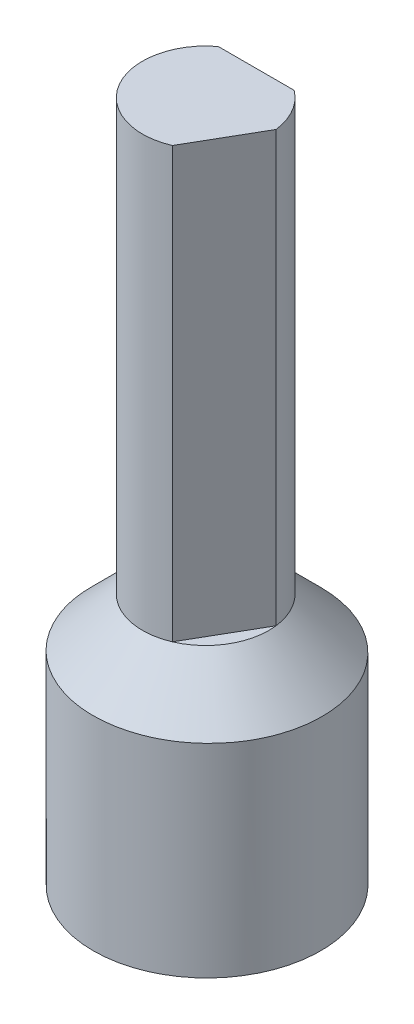
ISO-10303-21;
HEADER;
FILE_DESCRIPTION(('STEP AP214'),'2;1');
FILE_NAME('part.step','',(''),(''),'','','');
FILE_SCHEMA(('AUTOMOTIVE_DESIGN { 1 0 10303 214 1 1 1 1 }'));
ENDSEC;
DATA;
#1=APPLICATION_CONTEXT('core data for automotive mechanical design processes');
#2=APPLICATION_PROTOCOL_DEFINITION('international standard','automotive_design',2000,#1);
#3=PRODUCT_CONTEXT('',#1,'mechanical');
#4=PRODUCT('Part','Part','',(#3));
#5=PRODUCT_RELATED_PRODUCT_CATEGORY('part','',(#4));
#6=PRODUCT_DEFINITION_FORMATION('','',#4);
#7=PRODUCT_DEFINITION_CONTEXT('part definition',#1,'design');
#8=PRODUCT_DEFINITION('design','',#6,#7);
#9=PRODUCT_DEFINITION_SHAPE('','',#8);
#10=(LENGTH_UNIT() NAMED_UNIT(*) SI_UNIT(.MILLI.,.METRE.));
#11=(NAMED_UNIT(*) PLANE_ANGLE_UNIT() SI_UNIT($,.RADIAN.));
#12=(NAMED_UNIT(*) SI_UNIT($,.STERADIAN.) SOLID_ANGLE_UNIT());
#13=UNCERTAINTY_MEASURE_WITH_UNIT(LENGTH_MEASURE(1.E-05),#10,'distance_accuracy_value','');
#14=(GEOMETRIC_REPRESENTATION_CONTEXT(3) GLOBAL_UNCERTAINTY_ASSIGNED_CONTEXT((#13)) GLOBAL_UNIT_ASSIGNED_CONTEXT((#10,
#11,#12)) REPRESENTATION_CONTEXT('',''));
#15=CARTESIAN_POINT('',(0.,0.,0.));
#16=DIRECTION('',(0.,0.,1.));
#17=DIRECTION('',(1.,0.,0.));
#18=AXIS2_PLACEMENT_3D('',#15,#16,#17);
#19=CARTESIAN_POINT('',(4.55,54.,-4.44309113856709));
#20=DIRECTION('',(0.,-1.,0.));
#21=DIRECTION('',(0.,0.,-1.));
#22=AXIS2_PLACEMENT_3D('',#19,#20,#21);
#23=CYLINDRICAL_SURFACE('',#22,5.);
#24=CARTESIAN_POINT('',(4.55,54.,-4.44309113856709));
#25=DIRECTION('',(0.,1.,0.));
#26=DIRECTION('',(0.,0.,1.));
#27=AXIS2_PLACEMENT_3D('',#24,#25,#26);
#28=CIRCLE('',#27,5.);
#29=CARTESIAN_POINT('',(1.55,54.,-8.44309113856709));
#30=VERTEX_POINT('',#29);
#31=CARTESIAN_POINT('',(6.51410161513787,54.,0.154985072785897));
#32=VERTEX_POINT('',#31);
#33=EDGE_CURVE('E156',#30,#32,#28,.T.);
#34=ORIENTED_EDGE('',*,*,#33,.F.);
#35=DIRECTION('',(0.,1.,0.));
#36=VECTOR('',#35,1.);
#37=CARTESIAN_POINT('',(1.55,20.,-8.44309113856709));
#38=LINE('',#37,#36);
#39=CARTESIAN_POINT('',(1.55,20.,-8.44309113856709));
#40=VERTEX_POINT('',#39);
#41=EDGE_CURVE('E143',#40,#30,#38,.T.);
#42=ORIENTED_EDGE('',*,*,#41,.F.);
#43=CARTESIAN_POINT('',(4.55,20.,-4.44309113856709));
#44=DIRECTION('',(0.,1.,0.));
#45=DIRECTION('',(0.,0.,1.));
#46=AXIS2_PLACEMENT_3D('',#43,#44,#45);
#47=CIRCLE('',#46,5.);
#48=CARTESIAN_POINT('',(6.51410161513817,20.,0.154985072786042));
#49=VERTEX_POINT('',#48);
#50=EDGE_CURVE('E139',#40,#49,#47,.T.);
#51=ORIENTED_EDGE('',*,*,#50,.T.);
#52=DIRECTION('',(0.,1.,0.));
#53=VECTOR('',#52,1.);
#54=CARTESIAN_POINT('',(6.51410161513787,20.,0.154985072785897));
#55=LINE('',#54,#53);
#56=EDGE_CURVE('E177',#49,#32,#55,.T.);
#57=ORIENTED_EDGE('',*,*,#56,.T.);
#58=EDGE_LOOP('',(#34,#42,#51,#57));
#59=FACE_BOUND('',#58,.T.);
#60=ADVANCED_FACE('F62',(#59),#23,.T.);
#61=CARTESIAN_POINT('',(4.55,13.,-4.55));
#62=DIRECTION('',(0.,-1.,0.));
#63=DIRECTION('',(0.,0.,-1.));
#64=AXIS2_PLACEMENT_3D('',#61,#62,#63);
#65=CYLINDRICAL_SURFACE('',#64,9.00000000000001);
#66=CARTESIAN_POINT('',(4.55,15.8930911385671,-13.55));
#67=CARTESIAN_POINT('',(4.775603864408,15.893091092414,-13.5500040134664));
#68=CARTESIAN_POINT('',(5.00115276918959,15.8931907268578,-13.5415165682252));
#69=CARTESIAN_POINT('',(5.45102225742896,15.8935886228892,-13.507623319051));
#70=CARTESIAN_POINT('',(5.67534274400229,15.8938868999224,-13.4822161995124));
#71=CARTESIAN_POINT('',(6.12159554055374,15.8946808189605,-13.414595984954));
#72=CARTESIAN_POINT('',(6.3435260079471,15.8951766034081,-13.3723707606914));
#73=CARTESIAN_POINT('',(6.78359142890568,15.8963628041845,-13.2713553301387));
#74=CARTESIAN_POINT('',(7.00172619393906,15.8970532301519,-13.2125643035079));
#75=CARTESIAN_POINT('',(7.4589537100164,15.8987197357038,-13.070678938266));
#76=CARTESIAN_POINT('',(7.69740550725821,15.899720207692,-12.9855100253346));
#77=CARTESIAN_POINT('',(8.16630053589409,15.9019540375485,-12.7953856509577));
#78=CARTESIAN_POINT('',(8.39674308227459,15.9031874152789,-12.690428501976));
#79=CARTESIAN_POINT('',(8.84800097711115,15.9058787226085,-12.4614606145004));
#80=CARTESIAN_POINT('',(9.06881497237904,15.9073366836409,-12.3374472088656));
#81=CARTESIAN_POINT('',(9.49920884384148,15.9104669702164,-12.0712602811703));
#82=CARTESIAN_POINT('',(9.70878873567981,15.9121392954611,-11.9290867843992));
#83=CARTESIAN_POINT('',(10.1152182509084,15.9156867024861,-11.6275958970361));
#84=CARTESIAN_POINT('',(10.3120683277799,15.9175617770375,-11.468279117688));
#85=CARTESIAN_POINT('',(10.6916479864068,15.9215017726096,-11.1336295589165));
#86=CARTESIAN_POINT('',(10.8743774962272,15.9235666945975,-10.9582966979114));
#87=CARTESIAN_POINT('',(11.2243779064949,15.927871597166,-10.592902360141));
#88=CARTESIAN_POINT('',(11.391652175374,15.9301115394042,-10.4028441094192));
#89=CARTESIAN_POINT('',(11.709653971473,15.9347521352795,-10.0092479247673));
#90=CARTESIAN_POINT('',(11.8603757454315,15.9371528443317,-9.80570534316039));
#91=CARTESIAN_POINT('',(12.1441202990796,15.94209732161,-9.38666789903518));
#92=CARTESIAN_POINT('',(12.2771448461565,15.9446410755144,-9.1711742330982));
#93=CARTESIAN_POINT('',(12.5245693186725,15.949854157533,-8.72974459882064));
#94=CARTESIAN_POINT('',(12.6389689526749,15.9525234876114,-8.50380846715062));
#95=CARTESIAN_POINT('',(12.8483270826659,15.9579689894791,-8.04310556821392));
#96=CARTESIAN_POINT('',(12.9432857712038,15.9607451602098,-7.80833888843501));
#97=CARTESIAN_POINT('',(13.1130905818552,15.9663849646105,-7.33163635766089));
#98=CARTESIAN_POINT('',(13.1879362584181,15.9692486002164,-7.08970034797991));
#99=CARTESIAN_POINT('',(13.316972457898,15.9750427804429,-6.60041431046486));
#100=CARTESIAN_POINT('',(13.3711655343332,15.9779733167441,-6.35306495594631));
#101=CARTESIAN_POINT('',(13.4585398074682,15.9838820048739,-5.85459469410059));
#102=CARTESIAN_POINT('',(13.4917137224758,15.9868601728377,-5.60347251055653));
#103=CARTESIAN_POINT('',(13.5367800479926,15.9928415159462,-5.09937218696631));
#104=CARTESIAN_POINT('',(13.5486763285675,15.9958446864436,-4.84639439283298));
#105=CARTESIAN_POINT('',(13.5511147406005,16.0018553133885,-4.34033199481863));
#106=CARTESIAN_POINT('',(13.5416565392515,16.004862769902,-4.08724738933443));
#107=CARTESIAN_POINT('',(13.5014521490216,16.0108605774894,-3.58276988320231));
#108=CARTESIAN_POINT('',(13.4707055704765,16.013850928249,-3.33137701360511));
#109=CARTESIAN_POINT('',(13.3881415919928,16.0197931924753,-2.8320693158334));
#110=CARTESIAN_POINT('',(13.3363237257087,16.0227451050897,-2.58415456476156));
#111=CARTESIAN_POINT('',(13.2119968931481,16.028588754125,-2.09361663250509));
#112=CARTESIAN_POINT('',(13.1394917369093,16.0314805015214,-1.85099248578352));
#113=CARTESIAN_POINT('',(12.9742729467956,16.0371846136528,-1.37263011864889));
#114=CARTESIAN_POINT('',(12.8815523249016,16.0399969505567,-1.13689431141008));
#115=CARTESIAN_POINT('',(12.6765958123689,16.0455204172094,-0.674116739914238));
#116=CARTESIAN_POINT('',(12.564363603778,16.0482315659366,-0.447073345151337));
#117=CARTESIAN_POINT('',(12.3211677070281,16.0535336792489,-0.00324450834326062));
#118=CARTESIAN_POINT('',(12.1902037281491,16.0561246419679,0.213540774424937));
#119=CARTESIAN_POINT('',(11.9104791375181,16.0611675283223,0.635304061218014));
#120=CARTESIAN_POINT('',(11.7617188617197,16.0636194545811,0.840282288025059));
#121=CARTESIAN_POINT('',(11.4474536115317,16.068366572601,1.23698267797062));
#122=CARTESIAN_POINT('',(11.2819482677892,16.0706617609029,1.42870454855107));
#123=CARTESIAN_POINT('',(10.9354127035745,16.0750781221399,1.79748063383225));
#124=CARTESIAN_POINT('',(10.7543861151927,16.0771993355605,1.9745382611162));
#125=CARTESIAN_POINT('',(10.3779959733943,16.081253579272,2.31283568906051));
#126=CARTESIAN_POINT('',(10.1826274777294,16.0831865441532,2.47406999182123));
#127=CARTESIAN_POINT('',(9.77903485157717,16.0868489901541,2.77947631026745));
#128=CARTESIAN_POINT('',(9.57081305596342,16.0885785080662,2.92365141105384));
#129=CARTESIAN_POINT('',(9.14295890297771,16.0918218243709,3.19394986909186));
#130=CARTESIAN_POINT('',(8.92332636951165,16.0933356194331,3.32007294764613));
#131=CARTESIAN_POINT('',(8.47423519832534,16.0961362278272,3.55335724215497));
#132=CARTESIAN_POINT('',(8.24477743011519,16.0974230611933,3.66052013175167));
#133=CARTESIAN_POINT('',(7.77764376270915,16.0997604824102,3.85513768938699));
#134=CARTESIAN_POINT('',(7.53996768227655,16.1008110650471,3.94259192247461));
#135=CARTESIAN_POINT('',(7.05813719103441,16.1026680467662,4.09715261483647));
#136=CARTESIAN_POINT('',(6.81398399888267,16.1034744914329,4.16426287267948));
#137=CARTESIAN_POINT('',(6.32080528756834,16.1048377658048,4.27770039890891));
#138=CARTESIAN_POINT('',(6.07177808813795,16.1053945077872,4.32402036348484));
#139=CARTESIAN_POINT('',(5.57082162376915,16.1062536597262,4.39549665349715));
#140=CARTESIAN_POINT('',(5.31889374920862,16.1065561867793,4.42066272284404));
#141=CARTESIAN_POINT('',(4.81369880697251,16.1069051917754,4.44969488700844));
#142=CARTESIAN_POINT('',(4.56043118417038,16.1069515536268,4.45355132451104));
#143=CARTESIAN_POINT('',(4.05447174360575,16.1067875744621,4.43991084458027));
#144=CARTESIAN_POINT('',(3.80177992574966,16.1065772334877,4.42241393061821));
#145=CARTESIAN_POINT('',(3.2988834900321,16.1059015537297,4.36620404942922));
#146=CARTESIAN_POINT('',(3.04867779739952,16.1054363304947,4.32750069595176));
#147=CARTESIAN_POINT('',(2.55232089394262,16.1042541654229,4.22914082646687));
#148=CARTESIAN_POINT('',(2.30617126200754,16.1035371278785,4.16947634370956));
#149=CARTESIAN_POINT('',(1.81986018523815,16.1018569453935,4.02964608617196));
#150=CARTESIAN_POINT('',(1.57969666938562,16.1008938869032,3.9494875128958));
#151=CARTESIAN_POINT('',(1.10693071965722,16.0987284211633,3.76921195392469));
#152=CARTESIAN_POINT('',(0.874329704299009,16.0975259693079,3.66909124871545));
#153=CARTESIAN_POINT('',(0.418394289486635,16.0948906959341,3.44961527686235));
#154=CARTESIAN_POINT('',(0.195059685555608,16.0934578795024,3.33026043493189));
#155=CARTESIAN_POINT('',(-0.240770587850892,16.090372304328,3.07315764276184));
#156=CARTESIAN_POINT('',(-0.453265778161112,16.0887195358737,2.93540888037587));
#157=CARTESIAN_POINT('',(-0.865892982706087,16.0852062429038,2.64250414279808));
#158=CARTESIAN_POINT('',(-1.06602518787536,16.083345721598,2.48734843654417));
#159=CARTESIAN_POINT('',(-1.45254268398014,16.0794301529727,2.16070162916229));
#160=CARTESIAN_POINT('',(-1.63892547653914,16.0773750704539,1.98920757213654));
#161=CARTESIAN_POINT('',(-1.99651703704617,16.0730864114829,1.6311895911118));
#162=CARTESIAN_POINT('',(-2.16773103302747,16.0708528970372,1.44467088811204));
#163=CARTESIAN_POINT('',(-2.49388118591475,16.0662224449542,1.05783009828238));
#164=CARTESIAN_POINT('',(-2.64881333861037,16.0638254673542,0.857504635906059));
#165=CARTESIAN_POINT('',(-2.94124737373385,16.0588860474691,0.444519987582932));
#166=CARTESIAN_POINT('',(-3.07874964067341,16.0563436083946,0.23186107386893));
#167=CARTESIAN_POINT('',(-3.33535317681904,16.0511315924883,-0.204286709981536));
#168=CARTESIAN_POINT('',(-3.45445410717856,16.0484620133164,-0.427775779447512));
#169=CARTESIAN_POINT('',(-3.67340387917906,16.0430150966463,-0.883987887811673));
#170=CARTESIAN_POINT('',(-3.77325301915902,16.0402377608187,-1.11671078354874));
#171=CARTESIAN_POINT('',(-3.95301449341885,16.0345946017154,-1.58979865189083));
#172=CARTESIAN_POINT('',(-4.03292184604847,16.0317287565297,-1.83016551715944));
#173=CARTESIAN_POINT('',(-4.17217516209484,16.0259308484504,-2.31669229364746));
#174=CARTESIAN_POINT('',(-4.23152823062595,16.0229988088128,-2.56285017156936));
#175=CARTESIAN_POINT('',(-4.32929879774653,16.0170880072844,-3.0593360501941));
#176=CARTESIAN_POINT('',(-4.36771240880414,16.0141092368234,-3.30966481636218));
#177=CARTESIAN_POINT('',(-4.42331359873381,16.0081268541001,-3.81266271388173));
#178=CARTESIAN_POINT('',(-4.44050164629057,16.0051232423879,-4.06533179343229));
#179=CARTESIAN_POINT('',(-4.45353154503476,15.9991123133211,-4.57123589248006));
#180=CARTESIAN_POINT('',(-4.44937203273724,15.9961049957422,-4.82447094709396));
#181=CARTESIAN_POINT('',(-4.4197334516262,15.990108252368,-5.32968657995547));
#182=CARTESIAN_POINT('',(-4.39425471447342,15.9871188262952,-5.58166717765718));
#183=CARTESIAN_POINT('',(-4.32215256733984,15.9811784435513,-6.08263225311537));
#184=CARTESIAN_POINT('',(-4.27552530273905,15.9782274939941,-6.33161617618919));
#185=CARTESIAN_POINT('',(-4.16147621454504,15.9723864747825,-6.82468482230691));
#186=CARTESIAN_POINT('',(-4.09406159421005,15.9694963844091,-7.06877121129279));
#187=CARTESIAN_POINT('',(-3.93889580119854,15.9637957968992,-7.55044711104775));
#188=CARTESIAN_POINT('',(-3.8511405575543,15.9609853158222,-7.78803531061463));
#189=CARTESIAN_POINT('',(-3.65592680044404,15.9554643438022,-8.25496935357339));
#190=CARTESIAN_POINT('',(-3.54846872227228,15.9527538506518,-8.48431537892558));
#191=CARTESIAN_POINT('',(-3.31461261753177,15.9474517861591,-8.93313820608494));
#192=CARTESIAN_POINT('',(-3.18821473147861,15.9448602139348,-9.15261508109623));
#193=CARTESIAN_POINT('',(-2.91737896749222,15.9398141081411,-9.58013739479737));
#194=CARTESIAN_POINT('',(-2.77294137213827,15.9373595724261,-9.78818301247627));
#195=CARTESIAN_POINT('',(-2.46704030847673,15.9326044246822,-10.1913815652054));
#196=CARTESIAN_POINT('',(-2.30557562352198,15.9303038236717,-10.3865335773382));
#197=CARTESIAN_POINT('',(-1.96683560350713,15.9258734987684,-10.7624754268425));
#198=CARTESIAN_POINT('',(-1.78956576166769,15.9237437159913,-10.9432702132068));
#199=CARTESIAN_POINT('',(-1.4203635286893,15.9196682033156,-11.2893472286385));
#200=CARTESIAN_POINT('',(-1.22842611091004,15.9177225370304,-11.4546240960118));
#201=CARTESIAN_POINT('',(-0.831309547966557,15.9140295797097,-11.7684173619744));
#202=CARTESIAN_POINT('',(-0.626130553715104,15.9122822864139,-11.9169339515258));
#203=CARTESIAN_POINT('',(-0.203931570013947,15.9089976920433,-12.1961891820068));
#204=CARTESIAN_POINT('',(0.0130915186526284,15.9074604463032,-12.3269231382392));
#205=CARTESIAN_POINT('',(0.457380593925491,15.9046071205888,-12.5696349818116));
#206=CARTESIAN_POINT('',(0.684646488113765,15.9032910386194,-12.6816130383378));
#207=CARTESIAN_POINT('',(1.14765300664322,15.9008899267476,-12.8859468724052));
#208=CARTESIAN_POINT('',(1.38338756799202,15.89980473525,-12.9783163734418));
#209=CARTESIAN_POINT('',(1.86172464448639,15.8978719404485,-13.1428554130747));
#210=CARTESIAN_POINT('',(2.10432584412116,15.8970242919708,-13.2150287923856));
#211=CARTESIAN_POINT('',(2.70880839597729,15.8952345186443,-13.3674347099851));
#212=CARTESIAN_POINT('',(3.07373863104614,15.8944314836125,-13.4358313249479));
#213=CARTESIAN_POINT('',(3.80916297704601,15.8933599044795,-13.5271044566708));
#214=CARTESIAN_POINT('',(4.17965553977621,15.8930912143308,-13.5499934116154));
#215=CARTESIAN_POINT('',(4.55,15.8930911385671,-13.55));
#216=B_SPLINE_CURVE_WITH_KNOTS('',3,(#66,#67,#68,#69,#70,#71,#72,#73,#74,#75,#76,#77,#78,#79,
#80,#81,#82,#83,#84,#85,#86,#87,#88,#89,#90,#91,#92,#93,#94,#95,#96,#97,#98,#99,#100,#101,#102,
#103,#104,#105,#106,#107,#108,#109,#110,#111,#112,#113,#114,#115,#116,#117,#118,#119,#120,#121,
#122,#123,#124,#125,#126,#127,#128,#129,#130,#131,#132,#133,#134,#135,#136,#137,#138,#139,#140,
#141,#142,#143,#144,#145,#146,#147,#148,#149,#150,#151,#152,#153,#154,#155,#156,#157,#158,#159,
#160,#161,#162,#163,#164,#165,#166,#167,#168,#169,#170,#171,#172,#173,#174,#175,#176,#177,#178,
#179,#180,#181,#182,#183,#184,#185,#186,#187,#188,#189,#190,#191,#192,#193,#194,#195,#196,#197,
#198,#199,#200,#201,#202,#203,#204,#205,#206,#207,#208,#209,#210,#211,#212,#213,#214,#215),
.UNSPECIFIED.,.T.,.F.,(4,2,2,2,2,2,2,2,2,2,2,2,2,2,2,2,2,2,2,2,2,2,2,2,2,2,2,2,2,2,2,2,2,2,2,2,
2,2,2,2,2,2,2,2,2,2,2,2,2,2,2,2,2,2,2,2,2,2,2,2,2,2,2,2,2,2,2,2,2,2,2,2,2,2,4),(0.,
0.676556903297531,1.35316641907434,2.0302647928276,2.70739670248275,3.46610200699224,
4.22487204300567,4.9837483744491,5.74262364910885,6.50147187502408,7.26032396652177,
8.0190102759919,8.7779594580685,9.53683278839701,10.2957179921977,11.0545956793984,
11.8134901761448,12.5722908115856,13.3313541756818,14.0902794640906,14.849216580343,
15.6081675886117,16.3671353947467,17.1259635097243,17.8850543511097,18.6440020990208,
19.4029616271955,20.1619068302015,20.9208687772296,21.6796536035465,22.4387011472043,
23.1976112091063,23.9565329862285,24.7153877388158,25.474259236954,26.2329889533816,
26.991985009916,27.7506312656901,28.5096213042822,29.2686112194888,30.0272573377579,
30.7861921090913,31.5448605608214,32.3036705064432,33.0624636989034,33.8212904054279,
34.5801053896659,35.3390579186548,36.0977478433215,36.8566239188689,37.6154832503287,
38.3743565539377,39.133218096579,39.8922690207981,40.6510572971144,41.4099863989417,
42.168898742448,42.9278595588691,43.6868085684437,44.4458959628941,45.2047206125545,
45.9636972645426,46.7226571504974,47.4816114059611,48.2405537744345,48.9995504088784,
49.7582842681372,50.5172793249522,51.2762657331127,52.0354517047052,52.7946308277425,
53.5532768573147,54.3117785162986,55.4226974846014,56.5333127740154),.UNSPECIFIED.);
#217=CARTESIAN_POINT('',(4.55,15.8930911385671,-13.55));
#218=VERTEX_POINT('',#217);
#219=EDGE_CURVE('E12',#218,#218,#216,.T.);
#220=ORIENTED_EDGE('',*,*,#219,.T.);
#221=EDGE_LOOP('',(#220));
#222=FACE_BOUND('',#221,.T.);
#223=CARTESIAN_POINT('',(4.55,0.,-4.55));
#224=DIRECTION('',(0.,1.,0.));
#225=DIRECTION('',(0.,0.,1.));
#226=AXIS2_PLACEMENT_3D('',#223,#224,#225);
#227=CIRCLE('',#226,9.00000000000001);
#228=CARTESIAN_POINT('',(4.55,0.,4.45000000000001));
#229=VERTEX_POINT('',#228);
#230=EDGE_CURVE('E160',#229,#229,#227,.T.);
#231=ORIENTED_EDGE('',*,*,#230,.T.);
#232=EDGE_LOOP('',(#231));
#233=FACE_BOUND('',#232,.T.);
#234=ADVANCED_FACE('F263',(#222,#233),#65,.T.);
#235=CARTESIAN_POINT('',(4.55,0.,-4.55));
#236=DIRECTION('',(0.,1.,0.));
#237=DIRECTION('',(0.,0.,1.));
#238=AXIS2_PLACEMENT_3D('',#235,#236,#237);
#239=PLANE('',#238);
#240=DIRECTION('',(0.,0.,-1.));
#241=VECTOR('',#240,1.);
#242=CARTESIAN_POINT('',(9.1,0.,0.));
#243=LINE('',#242,#241);
#244=CARTESIAN_POINT('',(9.1,0.,0.));
#245=VERTEX_POINT('',#244);
#246=CARTESIAN_POINT('',(9.1,0.,-9.1));
#247=VERTEX_POINT('',#246);
#248=EDGE_CURVE('E210',#245,#247,#243,.T.);
#249=ORIENTED_EDGE('',*,*,#248,.T.);
#250=DIRECTION('',(1.,0.,0.));
#251=VECTOR('',#250,1.);
#252=CARTESIAN_POINT('',(0.,0.,-9.1));
#253=LINE('',#252,#251);
#254=CARTESIAN_POINT('',(0.,0.,-9.1));
#255=VERTEX_POINT('',#254);
#256=EDGE_CURVE('E207',#255,#247,#253,.T.);
#257=ORIENTED_EDGE('',*,*,#256,.F.);
#258=DIRECTION('',(0.,0.,-1.));
#259=VECTOR('',#258,1.);
#260=CARTESIAN_POINT('',(0.,0.,0.));
#261=LINE('',#260,#259);
#262=CARTESIAN_POINT('',(0.,0.,0.));
#263=VERTEX_POINT('',#262);
#264=EDGE_CURVE('E195',#263,#255,#261,.T.);
#265=ORIENTED_EDGE('',*,*,#264,.F.);
#266=DIRECTION('',(1.,0.,0.));
#267=VECTOR('',#266,1.);
#268=CARTESIAN_POINT('',(0.,0.,0.));
#269=LINE('',#268,#267);
#270=EDGE_CURVE('E214',#263,#245,#269,.T.);
#271=ORIENTED_EDGE('',*,*,#270,.T.);
#272=EDGE_LOOP('',(#249,#257,#265,#271));
#273=FACE_BOUND('',#272,.T.);
#274=ORIENTED_EDGE('',*,*,#230,.F.);
#275=EDGE_LOOP('',(#274));
#276=FACE_BOUND('',#275,.T.);
#277=ADVANCED_FACE('F239',(#273,#276),#239,.F.);
#278=CARTESIAN_POINT('',(0.,13.,-9.1));
#279=DIRECTION('',(0.,0.,-1.));
#280=DIRECTION('',(-1.,0.,0.));
#281=AXIS2_PLACEMENT_3D('',#278,#279,#280);
#282=PLANE('',#281);
#283=ORIENTED_EDGE('',*,*,#256,.T.);
#284=DIRECTION('',(0.,-1.,0.));
#285=VECTOR('',#284,1.);
#286=CARTESIAN_POINT('',(9.1,13.,-9.1));
#287=LINE('',#286,#285);
#288=CARTESIAN_POINT('',(9.1,13.,-9.1));
#289=VERTEX_POINT('',#288);
#290=EDGE_CURVE('E206',#289,#247,#287,.T.);
#291=ORIENTED_EDGE('',*,*,#290,.F.);
#292=DIRECTION('',(1.,0.,0.));
#293=VECTOR('',#292,1.);
#294=CARTESIAN_POINT('',(0.,13.,-9.1));
#295=LINE('',#294,#293);
#296=CARTESIAN_POINT('',(0.,13.,-9.1));
#297=VERTEX_POINT('',#296);
#298=EDGE_CURVE('E190',#297,#289,#295,.T.);
#299=ORIENTED_EDGE('',*,*,#298,.F.);
#300=DIRECTION('',(0.,-1.,0.));
#301=VECTOR('',#300,1.);
#302=CARTESIAN_POINT('',(0.,13.,-9.1));
#303=LINE('',#302,#301);
#304=EDGE_CURVE('E163',#297,#255,#303,.T.);
#305=ORIENTED_EDGE('',*,*,#304,.T.);
#306=EDGE_LOOP('',(#283,#291,#299,#305));
#307=FACE_BOUND('',#306,.T.);
#308=ADVANCED_FACE('F250',(#307),#282,.F.);
#309=CARTESIAN_POINT('',(0.,13.,0.));
#310=DIRECTION('',(-1.,0.,0.));
#311=DIRECTION('',(0.,0.,1.));
#312=AXIS2_PLACEMENT_3D('',#309,#310,#311);
#313=PLANE('',#312);
#314=ORIENTED_EDGE('',*,*,#264,.T.);
#315=ORIENTED_EDGE('',*,*,#304,.F.);
#316=DIRECTION('',(0.,0.,-1.));
#317=VECTOR('',#316,1.);
#318=CARTESIAN_POINT('',(0.,13.,0.));
#319=LINE('',#318,#317);
#320=CARTESIAN_POINT('',(0.,13.,0.));
#321=VERTEX_POINT('',#320);
#322=EDGE_CURVE('E202',#321,#297,#319,.T.);
#323=ORIENTED_EDGE('',*,*,#322,.F.);
#324=DIRECTION('',(0.,-1.,0.));
#325=VECTOR('',#324,1.);
#326=CARTESIAN_POINT('',(0.,13.,0.));
#327=LINE('',#326,#325);
#328=EDGE_CURVE('E223',#321,#263,#327,.T.);
#329=ORIENTED_EDGE('',*,*,#328,.T.);
#330=EDGE_LOOP('',(#314,#315,#323,#329));
#331=FACE_BOUND('',#330,.T.);
#332=ADVANCED_FACE('F252',(#331),#313,.F.);
#333=CARTESIAN_POINT('',(0.,13.,0.));
#334=DIRECTION('',(0.,0.,-1.));
#335=DIRECTION('',(-1.,0.,0.));
#336=AXIS2_PLACEMENT_3D('',#333,#334,#335);
#337=PLANE('',#336);
#338=ORIENTED_EDGE('',*,*,#270,.F.);
#339=ORIENTED_EDGE('',*,*,#328,.F.);
#340=DIRECTION('',(1.,0.,0.));
#341=VECTOR('',#340,1.);
#342=CARTESIAN_POINT('',(0.,13.,0.));
#343=LINE('',#342,#341);
#344=CARTESIAN_POINT('',(9.1,13.,0.));
#345=VERTEX_POINT('',#344);
#346=EDGE_CURVE('E198',#321,#345,#343,.T.);
#347=ORIENTED_EDGE('',*,*,#346,.T.);
#348=DIRECTION('',(0.,-1.,0.));
#349=VECTOR('',#348,1.);
#350=CARTESIAN_POINT('',(9.1,13.,0.));
#351=LINE('',#350,#349);
#352=EDGE_CURVE('E226',#345,#245,#351,.T.);
#353=ORIENTED_EDGE('',*,*,#352,.T.);
#354=EDGE_LOOP('',(#338,#339,#347,#353));
#355=FACE_BOUND('',#354,.T.);
#356=ADVANCED_FACE('F244',(#355),#337,.T.);
#357=CARTESIAN_POINT('',(9.1,13.,0.));
#358=DIRECTION('',(-1.,0.,0.));
#359=DIRECTION('',(0.,0.,1.));
#360=AXIS2_PLACEMENT_3D('',#357,#358,#359);
#361=PLANE('',#360);
#362=ORIENTED_EDGE('',*,*,#248,.F.);
#363=ORIENTED_EDGE('',*,*,#352,.F.);
#364=DIRECTION('',(0.,0.,-1.));
#365=VECTOR('',#364,1.);
#366=CARTESIAN_POINT('',(9.1,13.,0.));
#367=LINE('',#366,#365);
#368=EDGE_CURVE('E194',#345,#289,#367,.T.);
#369=ORIENTED_EDGE('',*,*,#368,.T.);
#370=ORIENTED_EDGE('',*,*,#290,.T.);
#371=EDGE_LOOP('',(#362,#363,#369,#370));
#372=FACE_BOUND('',#371,.T.);
#373=ADVANCED_FACE('F234',(#372),#361,.T.);
#374=CARTESIAN_POINT('',(4.55,13.,-4.55));
#375=DIRECTION('',(0.,1.,0.));
#376=DIRECTION('',(0.,0.,1.));
#377=AXIS2_PLACEMENT_3D('',#374,#375,#376);
#378=PLANE('',#377);
#379=ORIENTED_EDGE('',*,*,#322,.T.);
#380=ORIENTED_EDGE('',*,*,#298,.T.);
#381=ORIENTED_EDGE('',*,*,#368,.F.);
#382=ORIENTED_EDGE('',*,*,#346,.F.);
#383=EDGE_LOOP('',(#379,#380,#381,#382));
#384=FACE_BOUND('',#383,.T.);
#385=ADVANCED_FACE('F248',(#384),#378,.F.);
#386=CARTESIAN_POINT('',(9.5141016151379,20.,-5.04116734992072));
#387=VERTEX_POINT('',#386);
#388=CARTESIAN_POINT('',(7.55,20.,-8.44309113856709));
#389=VERTEX_POINT('',#388);
#390=EDGE_CURVE('E138',#387,#389,#47,.T.);
#391=ORIENTED_EDGE('',*,*,#390,.T.);
#392=DIRECTION('',(0.,1.,0.));
#393=VECTOR('',#392,1.);
#394=CARTESIAN_POINT('',(7.55,20.,-8.44309113856709));
#395=LINE('',#394,#393);
#396=CARTESIAN_POINT('',(7.55,54.,-8.44309113856709));
#397=VERTEX_POINT('',#396);
#398=EDGE_CURVE('E146',#389,#397,#395,.T.);
#399=ORIENTED_EDGE('',*,*,#398,.T.);
#400=CARTESIAN_POINT('',(9.5141016151379,54.,-5.04116734992072));
#401=VERTEX_POINT('',#400);
#402=EDGE_CURVE('E173',#401,#397,#28,.T.);
#403=ORIENTED_EDGE('',*,*,#402,.F.);
#404=DIRECTION('',(0.,1.,0.));
#405=VECTOR('',#404,1.);
#406=CARTESIAN_POINT('',(9.5141016151379,20.,-5.04116734992072));
#407=LINE('',#406,#405);
#408=EDGE_CURVE('E172',#387,#401,#407,.T.);
#409=ORIENTED_EDGE('',*,*,#408,.F.);
#410=EDGE_LOOP('',(#391,#399,#403,#409));
#411=FACE_BOUND('',#410,.T.);
#412=ADVANCED_FACE('F169',(#411),#23,.T.);
#413=CARTESIAN_POINT('',(4.55,54.,-4.44309113856709));
#414=DIRECTION('',(0.,1.,0.));
#415=DIRECTION('',(0.,0.,1.));
#416=AXIS2_PLACEMENT_3D('',#413,#414,#415);
#417=PLANE('',#416);
#418=DIRECTION('',(1.,0.,0.));
#419=VECTOR('',#418,1.);
#420=CARTESIAN_POINT('',(1.55,54.,-8.44309113856709));
#421=LINE('',#420,#419);
#422=EDGE_CURVE('E148',#30,#397,#421,.T.);
#423=ORIENTED_EDGE('',*,*,#422,.F.);
#424=ORIENTED_EDGE('',*,*,#33,.T.);
#425=DIRECTION('',(-0.500000000000004,0.,0.866025403784436));
#426=VECTOR('',#425,1.);
#427=CARTESIAN_POINT('',(9.5141016151379,54.,-5.04116734992072));
#428=LINE('',#427,#426);
#429=EDGE_CURVE('E181',#401,#32,#428,.T.);
#430=ORIENTED_EDGE('',*,*,#429,.F.);
#431=ORIENTED_EDGE('',*,*,#402,.T.);
#432=EDGE_LOOP('',(#423,#424,#430,#431));
#433=FACE_BOUND('',#432,.T.);
#434=ADVANCED_FACE('F271',(#433),#417,.T.);
#435=CARTESIAN_POINT('',(4.55,20.,-4.44309113856709));
#436=DIRECTION('',(0.,-1.,0.));
#437=DIRECTION('',(0.,0.,-1.));
#438=AXIS2_PLACEMENT_3D('',#435,#436,#437);
#439=CONICAL_SURFACE('',#438,5.,0.785398163397449);
#440=ORIENTED_EDGE('',*,*,#219,.F.);
#441=EDGE_LOOP('',(#440));
#442=FACE_BOUND('',#441,.T.);
#443=EDGE_CURVE('E76',#49,#387,#47,.T.);
#444=ORIENTED_EDGE('',*,*,#443,.F.);
#445=ORIENTED_EDGE('',*,*,#50,.F.);
#446=EDGE_CURVE('E131',#389,#40,#47,.T.);
#447=ORIENTED_EDGE('',*,*,#446,.F.);
#448=ORIENTED_EDGE('',*,*,#390,.F.);
#449=EDGE_LOOP('',(#444,#445,#447,#448));
#450=FACE_BOUND('',#449,.T.);
#451=ADVANCED_FACE('F65',(#442,#450),#439,.T.);
#452=CARTESIAN_POINT('',(0.,20.,0.));
#453=DIRECTION('',(0.,-1.,0.));
#454=DIRECTION('',(0.,0.,-1.));
#455=AXIS2_PLACEMENT_3D('',#452,#453,#454);
#456=PLANE('',#455);
#457=DIRECTION('',(-0.500000000000004,0.,0.866025403784436));
#458=VECTOR('',#457,1.);
#459=CARTESIAN_POINT('',(9.5141016151379,20.,-5.04116734992072));
#460=LINE('',#459,#458);
#461=EDGE_CURVE('E89',#387,#49,#460,.T.);
#462=ORIENTED_EDGE('',*,*,#461,.T.);
#463=ORIENTED_EDGE('',*,*,#443,.T.);
#464=EDGE_LOOP('',(#462,#463));
#465=FACE_BOUND('',#464,.T.);
#466=ADVANCED_FACE('F339',(#465),#456,.F.);
#467=CARTESIAN_POINT('',(9.5141016151379,20.,-5.04116734992072));
#468=DIRECTION('',(-0.866025403784436,0.,-0.500000000000004));
#469=DIRECTION('',(-0.500000000000004,0.,0.866025403784436));
#470=AXIS2_PLACEMENT_3D('',#467,#468,#469);
#471=PLANE('',#470);
#472=ORIENTED_EDGE('',*,*,#429,.T.);
#473=ORIENTED_EDGE('',*,*,#56,.F.);
#474=ORIENTED_EDGE('',*,*,#461,.F.);
#475=ORIENTED_EDGE('',*,*,#408,.T.);
#476=EDGE_LOOP('',(#472,#473,#474,#475));
#477=FACE_BOUND('',#476,.T.);
#478=ADVANCED_FACE('F352',(#477),#471,.F.);
#479=CARTESIAN_POINT('',(0.,20.,0.));
#480=DIRECTION('',(0.,1.,0.));
#481=DIRECTION('',(0.,0.,1.));
#482=AXIS2_PLACEMENT_3D('',#479,#480,#481);
#483=PLANE('',#482);
#484=ORIENTED_EDGE('',*,*,#446,.T.);
#485=DIRECTION('',(1.,0.,0.));
#486=VECTOR('',#485,1.);
#487=CARTESIAN_POINT('',(1.55,20.,-8.44309113856709));
#488=LINE('',#487,#486);
#489=EDGE_CURVE('E82',#40,#389,#488,.T.);
#490=ORIENTED_EDGE('',*,*,#489,.T.);
#491=EDGE_LOOP('',(#484,#490));
#492=FACE_BOUND('',#491,.T.);
#493=ADVANCED_FACE('F132',(#492),#483,.T.);
#494=CARTESIAN_POINT('',(1.55,20.,-8.44309113856709));
#495=DIRECTION('',(0.,0.,1.));
#496=DIRECTION('',(1.,0.,0.));
#497=AXIS2_PLACEMENT_3D('',#494,#495,#496);
#498=PLANE('',#497);
#499=ORIENTED_EDGE('',*,*,#422,.T.);
#500=ORIENTED_EDGE('',*,*,#398,.F.);
#501=ORIENTED_EDGE('',*,*,#489,.F.);
#502=ORIENTED_EDGE('',*,*,#41,.T.);
#503=EDGE_LOOP('',(#499,#500,#501,#502));
#504=FACE_BOUND('',#503,.T.);
#505=ADVANCED_FACE('F142',(#504),#498,.F.);
#506=CLOSED_SHELL('',(#60,#234,#277,#308,#332,#356,#373,#385,#412,#434,#451,#466,#478,#493,#505));
#507=MANIFOLD_SOLID_BREP('B2',#506);
#508=ADVANCED_BREP_SHAPE_REPRESENTATION('',(#18,#507),#14);
#509=SHAPE_DEFINITION_REPRESENTATION(#9,#508);
ENDSEC;
END-ISO-10303-21;
